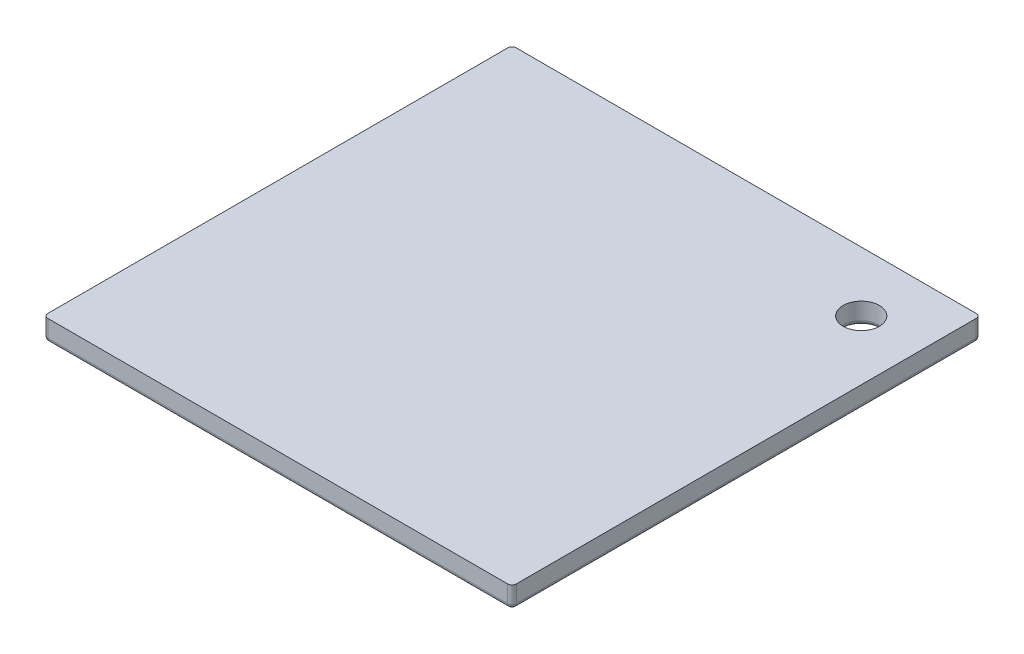
ISO-10303-21;
HEADER;
FILE_DESCRIPTION(('STEP AP214'),'2;1');
FILE_NAME('part.step','',(''),(''),'','','');
FILE_SCHEMA(('AUTOMOTIVE_DESIGN { 1 0 10303 214 1 1 1 1 }'));
ENDSEC;
DATA;
#1=APPLICATION_CONTEXT('core data for automotive mechanical design processes');
#2=APPLICATION_PROTOCOL_DEFINITION('international standard','automotive_design',2000,#1);
#3=PRODUCT_CONTEXT('',#1,'mechanical');
#4=PRODUCT('Part','Part','',(#3));
#5=PRODUCT_RELATED_PRODUCT_CATEGORY('part','',(#4));
#6=PRODUCT_DEFINITION_FORMATION('','',#4);
#7=PRODUCT_DEFINITION_CONTEXT('part definition',#1,'design');
#8=PRODUCT_DEFINITION('design','',#6,#7);
#9=PRODUCT_DEFINITION_SHAPE('','',#8);
#10=(LENGTH_UNIT() NAMED_UNIT(*) SI_UNIT(.MILLI.,.METRE.));
#11=(NAMED_UNIT(*) PLANE_ANGLE_UNIT() SI_UNIT($,.RADIAN.));
#12=(NAMED_UNIT(*) SI_UNIT($,.STERADIAN.) SOLID_ANGLE_UNIT());
#13=UNCERTAINTY_MEASURE_WITH_UNIT(LENGTH_MEASURE(1.E-05),#10,'distance_accuracy_value','');
#14=(GEOMETRIC_REPRESENTATION_CONTEXT(3) GLOBAL_UNCERTAINTY_ASSIGNED_CONTEXT((#13)) GLOBAL_UNIT_ASSIGNED_CONTEXT((#10,
#11,#12)) REPRESENTATION_CONTEXT('',''));
#15=CARTESIAN_POINT('',(0.,0.,0.));
#16=DIRECTION('',(0.,0.,1.));
#17=DIRECTION('',(1.,0.,0.));
#18=AXIS2_PLACEMENT_3D('',#15,#16,#17);
#19=CARTESIAN_POINT('',(110.,10.,0.));
#20=DIRECTION('',(1.,0.,0.));
#21=DIRECTION('',(0.,0.,-1.));
#22=AXIS2_PLACEMENT_3D('',#19,#20,#21);
#23=PLANE('',#22);
#24=DIRECTION('',(0.,-1.,0.));
#25=VECTOR('',#24,1.);
#26=CARTESIAN_POINT('',(110.,0.,108.));
#27=LINE('',#26,#25);
#28=CARTESIAN_POINT('',(110.,10.,108.));
#29=VERTEX_POINT('',#28);
#30=CARTESIAN_POINT('',(110.,2.,108.));
#31=VERTEX_POINT('',#30);
#32=EDGE_CURVE('E171',#29,#31,#27,.T.);
#33=ORIENTED_EDGE('',*,*,#32,.T.);
#34=DIRECTION('',(0.,0.,1.));
#35=VECTOR('',#34,1.);
#36=CARTESIAN_POINT('',(110.,2.,-108.));
#37=LINE('',#36,#35);
#38=CARTESIAN_POINT('',(110.,2.,-108.));
#39=VERTEX_POINT('',#38);
#40=EDGE_CURVE('E203',#31,#39,#37,.F.);
#41=ORIENTED_EDGE('',*,*,#40,.T.);
#42=DIRECTION('',(0.,-1.,0.));
#43=VECTOR('',#42,1.);
#44=CARTESIAN_POINT('',(110.,10.,-108.));
#45=LINE('',#44,#43);
#46=CARTESIAN_POINT('',(110.,10.,-108.));
#47=VERTEX_POINT('',#46);
#48=EDGE_CURVE('E175',#39,#47,#45,.F.);
#49=ORIENTED_EDGE('',*,*,#48,.T.);
#50=DIRECTION('',(0.,0.,1.));
#51=VECTOR('',#50,1.);
#52=CARTESIAN_POINT('',(110.,10.,0.));
#53=LINE('',#52,#51);
#54=EDGE_CURVE('E249',#47,#29,#53,.T.);
#55=ORIENTED_EDGE('',*,*,#54,.T.);
#56=EDGE_LOOP('',(#33,#41,#49,#55));
#57=FACE_BOUND('',#56,.T.);
#58=ADVANCED_FACE('F42',(#57),#23,.T.);
#59=CARTESIAN_POINT('',(0.,10.,-110.));
#60=DIRECTION('',(0.,0.,-1.));
#61=DIRECTION('',(-1.,0.,0.));
#62=AXIS2_PLACEMENT_3D('',#59,#60,#61);
#63=PLANE('',#62);
#64=DIRECTION('',(0.,-1.,0.));
#65=VECTOR('',#64,1.);
#66=CARTESIAN_POINT('',(108.,10.,-110.));
#67=LINE('',#66,#65);
#68=CARTESIAN_POINT('',(108.,10.,-110.));
#69=VERTEX_POINT('',#68);
#70=CARTESIAN_POINT('',(108.,2.,-110.));
#71=VERTEX_POINT('',#70);
#72=EDGE_CURVE('E132',#69,#71,#67,.T.);
#73=ORIENTED_EDGE('',*,*,#72,.T.);
#74=DIRECTION('',(1.,0.,0.));
#75=VECTOR('',#74,1.);
#76=CARTESIAN_POINT('',(-108.,2.,-110.));
#77=LINE('',#76,#75);
#78=CARTESIAN_POINT('',(-108.,2.,-110.));
#79=VERTEX_POINT('',#78);
#80=EDGE_CURVE('E209',#71,#79,#77,.F.);
#81=ORIENTED_EDGE('',*,*,#80,.T.);
#82=DIRECTION('',(0.,-1.,0.));
#83=VECTOR('',#82,1.);
#84=CARTESIAN_POINT('',(-108.,10.,-110.));
#85=LINE('',#84,#83);
#86=CARTESIAN_POINT('',(-108.,10.,-110.));
#87=VERTEX_POINT('',#86);
#88=EDGE_CURVE('E168',#79,#87,#85,.F.);
#89=ORIENTED_EDGE('',*,*,#88,.T.);
#90=DIRECTION('',(1.,0.,0.));
#91=VECTOR('',#90,1.);
#92=CARTESIAN_POINT('',(0.,10.,-110.));
#93=LINE('',#92,#91);
#94=EDGE_CURVE('E255',#87,#69,#93,.T.);
#95=ORIENTED_EDGE('',*,*,#94,.T.);
#96=EDGE_LOOP('',(#73,#81,#89,#95));
#97=FACE_BOUND('',#96,.T.);
#98=ADVANCED_FACE('F284',(#97),#63,.T.);
#99=CARTESIAN_POINT('',(-110.,10.,0.));
#100=DIRECTION('',(1.,0.,0.));
#101=DIRECTION('',(0.,0.,-1.));
#102=AXIS2_PLACEMENT_3D('',#99,#100,#101);
#103=PLANE('',#102);
#104=DIRECTION('',(0.,-1.,0.));
#105=VECTOR('',#104,1.);
#106=CARTESIAN_POINT('',(-110.,0.,-108.));
#107=LINE('',#106,#105);
#108=CARTESIAN_POINT('',(-110.,10.,-108.));
#109=VERTEX_POINT('',#108);
#110=CARTESIAN_POINT('',(-110.,2.,-108.));
#111=VERTEX_POINT('',#110);
#112=EDGE_CURVE('E146',#109,#111,#107,.T.);
#113=ORIENTED_EDGE('',*,*,#112,.T.);
#114=DIRECTION('',(0.,0.,1.));
#115=VECTOR('',#114,1.);
#116=CARTESIAN_POINT('',(-110.,2.,0.));
#117=LINE('',#116,#115);
#118=CARTESIAN_POINT('',(-110.,2.,108.));
#119=VERTEX_POINT('',#118);
#120=EDGE_CURVE('E67',#111,#119,#117,.T.);
#121=ORIENTED_EDGE('',*,*,#120,.T.);
#122=DIRECTION('',(0.,-1.,0.));
#123=VECTOR('',#122,1.);
#124=CARTESIAN_POINT('',(-110.,10.,108.));
#125=LINE('',#124,#123);
#126=CARTESIAN_POINT('',(-110.,10.,108.));
#127=VERTEX_POINT('',#126);
#128=EDGE_CURVE('E150',#119,#127,#125,.F.);
#129=ORIENTED_EDGE('',*,*,#128,.T.);
#130=DIRECTION('',(0.,0.,1.));
#131=VECTOR('',#130,1.);
#132=CARTESIAN_POINT('',(-110.,10.,0.));
#133=LINE('',#132,#131);
#134=EDGE_CURVE('E130',#109,#127,#133,.T.);
#135=ORIENTED_EDGE('',*,*,#134,.F.);
#136=EDGE_LOOP('',(#113,#121,#129,#135));
#137=FACE_BOUND('',#136,.T.);
#138=ADVANCED_FACE('F289',(#137),#103,.F.);
#139=CARTESIAN_POINT('',(0.,10.,110.));
#140=DIRECTION('',(0.,0.,-1.));
#141=DIRECTION('',(-1.,0.,0.));
#142=AXIS2_PLACEMENT_3D('',#139,#140,#141);
#143=PLANE('',#142);
#144=DIRECTION('',(0.,-1.,0.));
#145=VECTOR('',#144,1.);
#146=CARTESIAN_POINT('',(-108.,10.,110.));
#147=LINE('',#146,#145);
#148=CARTESIAN_POINT('',(-108.,10.,110.));
#149=VERTEX_POINT('',#148);
#150=CARTESIAN_POINT('',(-108.,2.,110.));
#151=VERTEX_POINT('',#150);
#152=EDGE_CURVE('E137',#149,#151,#147,.T.);
#153=ORIENTED_EDGE('',*,*,#152,.T.);
#154=DIRECTION('',(1.,0.,0.));
#155=VECTOR('',#154,1.);
#156=CARTESIAN_POINT('',(0.,2.,110.));
#157=LINE('',#156,#155);
#158=CARTESIAN_POINT('',(108.,2.,110.));
#159=VERTEX_POINT('',#158);
#160=EDGE_CURVE('E11',#151,#159,#157,.T.);
#161=ORIENTED_EDGE('',*,*,#160,.T.);
#162=DIRECTION('',(0.,-1.,0.));
#163=VECTOR('',#162,1.);
#164=CARTESIAN_POINT('',(108.,10.,110.));
#165=LINE('',#164,#163);
#166=CARTESIAN_POINT('',(108.,10.,110.));
#167=VERTEX_POINT('',#166);
#168=EDGE_CURVE('E140',#159,#167,#165,.F.);
#169=ORIENTED_EDGE('',*,*,#168,.T.);
#170=DIRECTION('',(1.,0.,0.));
#171=VECTOR('',#170,1.);
#172=CARTESIAN_POINT('',(0.,10.,110.));
#173=LINE('',#172,#171);
#174=EDGE_CURVE('E127',#149,#167,#173,.T.);
#175=ORIENTED_EDGE('',*,*,#174,.F.);
#176=EDGE_LOOP('',(#153,#161,#169,#175));
#177=FACE_BOUND('',#176,.T.);
#178=ADVANCED_FACE('F136',(#177),#143,.F.);
#179=CARTESIAN_POINT('',(82.,10.,-82.));
#180=DIRECTION('',(0.,-1.,0.));
#181=DIRECTION('',(0.,0.,-1.));
#182=AXIS2_PLACEMENT_3D('',#179,#180,#181);
#183=CYLINDRICAL_SURFACE('',#182,8.50000000000001);
#184=CARTESIAN_POINT('',(82.,2.,-82.));
#185=DIRECTION('',(0.,1.,0.));
#186=DIRECTION('',(0.,0.,1.));
#187=AXIS2_PLACEMENT_3D('',#184,#185,#186);
#188=CIRCLE('',#187,8.50000000000001);
#189=CARTESIAN_POINT('',(82.,2.,-73.5));
#190=VERTEX_POINT('',#189);
#191=EDGE_CURVE('E195',#190,#190,#188,.F.);
#192=ORIENTED_EDGE('',*,*,#191,.T.);
#193=EDGE_LOOP('',(#192));
#194=FACE_BOUND('',#193,.T.);
#195=CARTESIAN_POINT('',(82.,10.,-82.));
#196=DIRECTION('',(0.,1.,0.));
#197=DIRECTION('',(0.,0.,1.));
#198=AXIS2_PLACEMENT_3D('',#195,#196,#197);
#199=CIRCLE('',#198,8.50000000000001);
#200=CARTESIAN_POINT('',(82.,10.,-73.5));
#201=VERTEX_POINT('',#200);
#202=EDGE_CURVE('E142',#201,#201,#199,.T.);
#203=ORIENTED_EDGE('',*,*,#202,.T.);
#204=EDGE_LOOP('',(#203));
#205=FACE_BOUND('',#204,.T.);
#206=ADVANCED_FACE('F269',(#194,#205),#183,.F.);
#207=CARTESIAN_POINT('',(0.,10.,0.));
#208=DIRECTION('',(0.,1.,0.));
#209=DIRECTION('',(0.,0.,1.));
#210=AXIS2_PLACEMENT_3D('',#207,#208,#209);
#211=PLANE('',#210);
#212=ORIENTED_EDGE('',*,*,#134,.T.);
#213=CARTESIAN_POINT('',(-108.,10.,108.));
#214=DIRECTION('',(0.,1.,0.));
#215=DIRECTION('',(0.,0.,1.));
#216=AXIS2_PLACEMENT_3D('',#213,#214,#215);
#217=CIRCLE('',#216,2.);
#218=EDGE_CURVE('E123',#127,#149,#217,.T.);
#219=ORIENTED_EDGE('',*,*,#218,.T.);
#220=ORIENTED_EDGE('',*,*,#174,.T.);
#221=CARTESIAN_POINT('',(108.,10.,108.));
#222=DIRECTION('',(0.,1.,0.));
#223=DIRECTION('',(0.,0.,1.));
#224=AXIS2_PLACEMENT_3D('',#221,#222,#223);
#225=CIRCLE('',#224,2.);
#226=EDGE_CURVE('E157',#167,#29,#225,.T.);
#227=ORIENTED_EDGE('',*,*,#226,.T.);
#228=ORIENTED_EDGE('',*,*,#54,.F.);
#229=CARTESIAN_POINT('',(108.,10.,-108.));
#230=DIRECTION('',(0.,1.,0.));
#231=DIRECTION('',(0.,0.,1.));
#232=AXIS2_PLACEMENT_3D('',#229,#230,#231);
#233=CIRCLE('',#232,2.);
#234=EDGE_CURVE('E160',#47,#69,#233,.T.);
#235=ORIENTED_EDGE('',*,*,#234,.T.);
#236=ORIENTED_EDGE('',*,*,#94,.F.);
#237=CARTESIAN_POINT('',(-108.,10.,-108.));
#238=DIRECTION('',(0.,1.,0.));
#239=DIRECTION('',(0.,0.,1.));
#240=AXIS2_PLACEMENT_3D('',#237,#238,#239);
#241=CIRCLE('',#240,2.);
#242=EDGE_CURVE('E133',#87,#109,#241,.T.);
#243=ORIENTED_EDGE('',*,*,#242,.T.);
#244=EDGE_LOOP('',(#212,#219,#220,#227,#228,#235,#236,#243));
#245=FACE_BOUND('',#244,.T.);
#246=ORIENTED_EDGE('',*,*,#202,.F.);
#247=EDGE_LOOP('',(#246));
#248=FACE_BOUND('',#247,.T.);
#249=ADVANCED_FACE('F125',(#245,#248),#211,.T.);
#250=CARTESIAN_POINT('',(0.,0.,0.));
#251=DIRECTION('',(0.,1.,0.));
#252=DIRECTION('',(0.,0.,1.));
#253=AXIS2_PLACEMENT_3D('',#250,#251,#252);
#254=PLANE('',#253);
#255=CARTESIAN_POINT('',(82.,0.,-82.));
#256=DIRECTION('',(0.,1.,0.));
#257=DIRECTION('',(0.,0.,1.));
#258=AXIS2_PLACEMENT_3D('',#255,#256,#257);
#259=CIRCLE('',#258,10.5);
#260=CARTESIAN_POINT('',(82.,0.,-71.5));
#261=VERTEX_POINT('',#260);
#262=EDGE_CURVE('E191',#261,#261,#259,.T.);
#263=ORIENTED_EDGE('',*,*,#262,.T.);
#264=EDGE_LOOP('',(#263));
#265=FACE_BOUND('',#264,.T.);
#266=DIRECTION('',(1.,0.,0.));
#267=VECTOR('',#266,1.);
#268=CARTESIAN_POINT('',(108.,0.,-108.));
#269=LINE('',#268,#267);
#270=CARTESIAN_POINT('',(-108.,0.,-108.));
#271=VERTEX_POINT('',#270);
#272=CARTESIAN_POINT('',(108.,0.,-108.));
#273=VERTEX_POINT('',#272);
#274=EDGE_CURVE('E184',#271,#273,#269,.T.);
#275=ORIENTED_EDGE('',*,*,#274,.T.);
#276=DIRECTION('',(0.,0.,1.));
#277=VECTOR('',#276,1.);
#278=CARTESIAN_POINT('',(108.,0.,108.));
#279=LINE('',#278,#277);
#280=CARTESIAN_POINT('',(108.,0.,108.));
#281=VERTEX_POINT('',#280);
#282=EDGE_CURVE('E187',#273,#281,#279,.T.);
#283=ORIENTED_EDGE('',*,*,#282,.T.);
#284=DIRECTION('',(1.,0.,0.));
#285=VECTOR('',#284,1.);
#286=CARTESIAN_POINT('',(0.,0.,108.));
#287=LINE('',#286,#285);
#288=CARTESIAN_POINT('',(-108.,0.,108.));
#289=VERTEX_POINT('',#288);
#290=EDGE_CURVE('E178',#281,#289,#287,.F.);
#291=ORIENTED_EDGE('',*,*,#290,.T.);
#292=DIRECTION('',(0.,0.,1.));
#293=VECTOR('',#292,1.);
#294=CARTESIAN_POINT('',(-108.,0.,0.));
#295=LINE('',#294,#293);
#296=EDGE_CURVE('E181',#289,#271,#295,.F.);
#297=ORIENTED_EDGE('',*,*,#296,.T.);
#298=EDGE_LOOP('',(#275,#283,#291,#297));
#299=FACE_BOUND('',#298,.T.);
#300=ADVANCED_FACE('F271',(#265,#299),#254,.F.);
#301=CARTESIAN_POINT('',(-108.,10.,108.));
#302=DIRECTION('',(0.,-1.,0.));
#303=DIRECTION('',(0.,0.,-1.));
#304=AXIS2_PLACEMENT_3D('',#301,#302,#303);
#305=CYLINDRICAL_SURFACE('',#304,2.);
#306=ORIENTED_EDGE('',*,*,#128,.F.);
#307=CARTESIAN_POINT('',(-108.,2.,108.));
#308=DIRECTION('',(0.,-1.,0.));
#309=DIRECTION('',(0.,0.,-1.));
#310=AXIS2_PLACEMENT_3D('',#307,#308,#309);
#311=CIRCLE('',#310,2.);
#312=EDGE_CURVE('E52',#119,#151,#311,.F.);
#313=ORIENTED_EDGE('',*,*,#312,.T.);
#314=ORIENTED_EDGE('',*,*,#152,.F.);
#315=ORIENTED_EDGE('',*,*,#218,.F.);
#316=EDGE_LOOP('',(#306,#313,#314,#315));
#317=FACE_BOUND('',#316,.T.);
#318=ADVANCED_FACE('F144',(#317),#305,.T.);
#319=CARTESIAN_POINT('',(-108.,10.,-108.));
#320=DIRECTION('',(0.,1.,0.));
#321=DIRECTION('',(0.,0.,1.));
#322=AXIS2_PLACEMENT_3D('',#319,#320,#321);
#323=CYLINDRICAL_SURFACE('',#322,2.);
#324=ORIENTED_EDGE('',*,*,#88,.F.);
#325=CARTESIAN_POINT('',(-108.,2.,-108.));
#326=DIRECTION('',(0.,1.,0.));
#327=DIRECTION('',(0.,0.,1.));
#328=AXIS2_PLACEMENT_3D('',#325,#326,#327);
#329=CIRCLE('',#328,2.);
#330=EDGE_CURVE('E212',#79,#111,#329,.T.);
#331=ORIENTED_EDGE('',*,*,#330,.T.);
#332=ORIENTED_EDGE('',*,*,#112,.F.);
#333=ORIENTED_EDGE('',*,*,#242,.F.);
#334=EDGE_LOOP('',(#324,#331,#332,#333));
#335=FACE_BOUND('',#334,.T.);
#336=ADVANCED_FACE('F296',(#335),#323,.T.);
#337=CARTESIAN_POINT('',(108.,10.,-108.));
#338=DIRECTION('',(0.,-1.,0.));
#339=DIRECTION('',(0.,0.,-1.));
#340=AXIS2_PLACEMENT_3D('',#337,#338,#339);
#341=CYLINDRICAL_SURFACE('',#340,2.);
#342=ORIENTED_EDGE('',*,*,#48,.F.);
#343=CARTESIAN_POINT('',(108.,2.,-108.));
#344=DIRECTION('',(0.,-1.,0.));
#345=DIRECTION('',(0.,0.,-1.));
#346=AXIS2_PLACEMENT_3D('',#343,#344,#345);
#347=CIRCLE('',#346,2.);
#348=EDGE_CURVE('E206',#39,#71,#347,.F.);
#349=ORIENTED_EDGE('',*,*,#348,.T.);
#350=ORIENTED_EDGE('',*,*,#72,.F.);
#351=ORIENTED_EDGE('',*,*,#234,.F.);
#352=EDGE_LOOP('',(#342,#349,#350,#351));
#353=FACE_BOUND('',#352,.T.);
#354=ADVANCED_FACE('F299',(#353),#341,.T.);
#355=CARTESIAN_POINT('',(108.,10.,108.));
#356=DIRECTION('',(0.,1.,0.));
#357=DIRECTION('',(0.,0.,1.));
#358=AXIS2_PLACEMENT_3D('',#355,#356,#357);
#359=CYLINDRICAL_SURFACE('',#358,2.);
#360=ORIENTED_EDGE('',*,*,#168,.F.);
#361=CARTESIAN_POINT('',(108.,2.,108.));
#362=DIRECTION('',(0.,1.,0.));
#363=DIRECTION('',(0.,0.,1.));
#364=AXIS2_PLACEMENT_3D('',#361,#362,#363);
#365=CIRCLE('',#364,2.);
#366=EDGE_CURVE('E199',#159,#31,#365,.T.);
#367=ORIENTED_EDGE('',*,*,#366,.T.);
#368=ORIENTED_EDGE('',*,*,#32,.F.);
#369=ORIENTED_EDGE('',*,*,#226,.F.);
#370=EDGE_LOOP('',(#360,#367,#368,#369));
#371=FACE_BOUND('',#370,.T.);
#372=ADVANCED_FACE('F303',(#371),#359,.T.);
#373=CARTESIAN_POINT('',(82.,2.,-82.));
#374=DIRECTION('',(0.,1.,0.));
#375=DIRECTION('',(0.,0.,1.));
#376=AXIS2_PLACEMENT_3D('',#373,#374,#375);
#377=TOROIDAL_SURFACE('',#376,10.5,2.);
#378=ORIENTED_EDGE('',*,*,#191,.F.);
#379=EDGE_LOOP('',(#378));
#380=FACE_BOUND('',#379,.T.);
#381=ORIENTED_EDGE('',*,*,#262,.F.);
#382=EDGE_LOOP('',(#381));
#383=FACE_BOUND('',#382,.T.);
#384=ADVANCED_FACE('F307',(#380,#383),#377,.T.);
#385=CARTESIAN_POINT('',(-108.,2.,-108.));
#386=DIRECTION('',(0.,1.,0.));
#387=DIRECTION('',(0.,0.,1.));
#388=AXIS2_PLACEMENT_3D('',#385,#386,#387);
#389=SPHERICAL_SURFACE('',#388,2.);
#390=CARTESIAN_POINT('',(-108.,2.,-108.));
#391=DIRECTION('',(0.,0.,1.));
#392=DIRECTION('',(1.,0.,0.));
#393=AXIS2_PLACEMENT_3D('',#390,#391,#392);
#394=CIRCLE('',#393,2.);
#395=EDGE_CURVE('E240',#111,#271,#394,.T.);
#396=ORIENTED_EDGE('',*,*,#395,.F.);
#397=ORIENTED_EDGE('',*,*,#330,.F.);
#398=CARTESIAN_POINT('',(-108.,2.,-108.));
#399=DIRECTION('',(1.,0.,0.));
#400=DIRECTION('',(0.,0.,-1.));
#401=AXIS2_PLACEMENT_3D('',#398,#399,#400);
#402=CIRCLE('',#401,2.);
#403=EDGE_CURVE('E46',#271,#79,#402,.T.);
#404=ORIENTED_EDGE('',*,*,#403,.F.);
#405=EDGE_LOOP('',(#396,#397,#404));
#406=FACE_BOUND('',#405,.T.);
#407=ADVANCED_FACE('F44',(#406),#389,.T.);
#408=CARTESIAN_POINT('',(0.,2.,-108.));
#409=DIRECTION('',(-1.,0.,0.));
#410=DIRECTION('',(0.,0.,1.));
#411=AXIS2_PLACEMENT_3D('',#408,#409,#410);
#412=CYLINDRICAL_SURFACE('',#411,2.);
#413=ORIENTED_EDGE('',*,*,#403,.T.);
#414=ORIENTED_EDGE('',*,*,#80,.F.);
#415=CARTESIAN_POINT('',(108.,2.,-108.));
#416=DIRECTION('',(1.,0.,0.));
#417=DIRECTION('',(0.,0.,-1.));
#418=AXIS2_PLACEMENT_3D('',#415,#416,#417);
#419=CIRCLE('',#418,2.);
#420=EDGE_CURVE('E237',#273,#71,#419,.T.);
#421=ORIENTED_EDGE('',*,*,#420,.F.);
#422=ORIENTED_EDGE('',*,*,#274,.F.);
#423=EDGE_LOOP('',(#413,#414,#421,#422));
#424=FACE_BOUND('',#423,.T.);
#425=ADVANCED_FACE('F334',(#424),#412,.T.);
#426=CARTESIAN_POINT('',(-108.,2.,0.));
#427=DIRECTION('',(0.,0.,1.));
#428=DIRECTION('',(1.,0.,0.));
#429=AXIS2_PLACEMENT_3D('',#426,#427,#428);
#430=CYLINDRICAL_SURFACE('',#429,2.);
#431=ORIENTED_EDGE('',*,*,#395,.T.);
#432=ORIENTED_EDGE('',*,*,#296,.F.);
#433=CARTESIAN_POINT('',(-108.,2.,108.));
#434=DIRECTION('',(0.,0.,1.));
#435=DIRECTION('',(1.,0.,0.));
#436=AXIS2_PLACEMENT_3D('',#433,#434,#435);
#437=CIRCLE('',#436,2.);
#438=EDGE_CURVE('E233',#119,#289,#437,.T.);
#439=ORIENTED_EDGE('',*,*,#438,.F.);
#440=ORIENTED_EDGE('',*,*,#120,.F.);
#441=EDGE_LOOP('',(#431,#432,#439,#440));
#442=FACE_BOUND('',#441,.T.);
#443=ADVANCED_FACE('F331',(#442),#430,.T.);
#444=CARTESIAN_POINT('',(108.,2.,-108.));
#445=DIRECTION('',(0.,1.,0.));
#446=DIRECTION('',(0.,0.,1.));
#447=AXIS2_PLACEMENT_3D('',#444,#445,#446);
#448=SPHERICAL_SURFACE('',#447,2.);
#449=ORIENTED_EDGE('',*,*,#420,.T.);
#450=ORIENTED_EDGE('',*,*,#348,.F.);
#451=CARTESIAN_POINT('',(108.,2.,-108.));
#452=DIRECTION('',(0.,0.,1.));
#453=DIRECTION('',(1.,0.,0.));
#454=AXIS2_PLACEMENT_3D('',#451,#452,#453);
#455=CIRCLE('',#454,2.);
#456=EDGE_CURVE('E229',#273,#39,#455,.T.);
#457=ORIENTED_EDGE('',*,*,#456,.F.);
#458=EDGE_LOOP('',(#449,#450,#457));
#459=FACE_BOUND('',#458,.T.);
#460=ADVANCED_FACE('F327',(#459),#448,.T.);
#461=CARTESIAN_POINT('',(-108.,2.,108.));
#462=DIRECTION('',(0.,1.,0.));
#463=DIRECTION('',(0.,0.,1.));
#464=AXIS2_PLACEMENT_3D('',#461,#462,#463);
#465=SPHERICAL_SURFACE('',#464,2.);
#466=ORIENTED_EDGE('',*,*,#312,.F.);
#467=ORIENTED_EDGE('',*,*,#438,.T.);
#468=CARTESIAN_POINT('',(-108.,2.,108.));
#469=DIRECTION('',(1.,0.,0.));
#470=DIRECTION('',(0.,0.,-1.));
#471=AXIS2_PLACEMENT_3D('',#468,#469,#470);
#472=CIRCLE('',#471,2.);
#473=EDGE_CURVE('E225',#151,#289,#472,.T.);
#474=ORIENTED_EDGE('',*,*,#473,.F.);
#475=EDGE_LOOP('',(#466,#467,#474));
#476=FACE_BOUND('',#475,.T.);
#477=ADVANCED_FACE('F323',(#476),#465,.T.);
#478=CARTESIAN_POINT('',(108.,2.,0.));
#479=DIRECTION('',(0.,0.,-1.));
#480=DIRECTION('',(-1.,0.,0.));
#481=AXIS2_PLACEMENT_3D('',#478,#479,#480);
#482=CYLINDRICAL_SURFACE('',#481,2.);
#483=ORIENTED_EDGE('',*,*,#456,.T.);
#484=ORIENTED_EDGE('',*,*,#40,.F.);
#485=CARTESIAN_POINT('',(108.,2.,108.));
#486=DIRECTION('',(0.,0.,1.));
#487=DIRECTION('',(1.,0.,0.));
#488=AXIS2_PLACEMENT_3D('',#485,#486,#487);
#489=CIRCLE('',#488,2.);
#490=EDGE_CURVE('E222',#281,#31,#489,.T.);
#491=ORIENTED_EDGE('',*,*,#490,.F.);
#492=ORIENTED_EDGE('',*,*,#282,.F.);
#493=EDGE_LOOP('',(#483,#484,#491,#492));
#494=FACE_BOUND('',#493,.T.);
#495=ADVANCED_FACE('F319',(#494),#482,.T.);
#496=CARTESIAN_POINT('',(0.,2.,108.));
#497=DIRECTION('',(1.,0.,0.));
#498=DIRECTION('',(0.,0.,-1.));
#499=AXIS2_PLACEMENT_3D('',#496,#497,#498);
#500=CYLINDRICAL_SURFACE('',#499,2.);
#501=ORIENTED_EDGE('',*,*,#473,.T.);
#502=ORIENTED_EDGE('',*,*,#290,.F.);
#503=CARTESIAN_POINT('',(108.,2.,108.));
#504=DIRECTION('',(1.,0.,0.));
#505=DIRECTION('',(0.,0.,-1.));
#506=AXIS2_PLACEMENT_3D('',#503,#504,#505);
#507=CIRCLE('',#506,2.);
#508=EDGE_CURVE('E219',#159,#281,#507,.T.);
#509=ORIENTED_EDGE('',*,*,#508,.F.);
#510=ORIENTED_EDGE('',*,*,#160,.F.);
#511=EDGE_LOOP('',(#501,#502,#509,#510));
#512=FACE_BOUND('',#511,.T.);
#513=ADVANCED_FACE('F315',(#512),#500,.T.);
#514=CARTESIAN_POINT('',(108.,2.,108.));
#515=DIRECTION('',(0.,1.,0.));
#516=DIRECTION('',(0.,0.,1.));
#517=AXIS2_PLACEMENT_3D('',#514,#515,#516);
#518=SPHERICAL_SURFACE('',#517,2.);
#519=ORIENTED_EDGE('',*,*,#490,.T.);
#520=ORIENTED_EDGE('',*,*,#366,.F.);
#521=ORIENTED_EDGE('',*,*,#508,.T.);
#522=EDGE_LOOP('',(#519,#520,#521));
#523=FACE_BOUND('',#522,.T.);
#524=ADVANCED_FACE('F312',(#523),#518,.T.);
#525=CLOSED_SHELL('',(#58,#98,#138,#178,#206,#249,#300,#318,#336,#354,#372,#384,#407,#425,#443,
#460,#477,#495,#513,#524));
#526=MANIFOLD_SOLID_BREP('B2',#525);
#527=ADVANCED_BREP_SHAPE_REPRESENTATION('',(#18,#526),#14);
#528=SHAPE_DEFINITION_REPRESENTATION(#9,#527);
ENDSEC;
END-ISO-10303-21;
